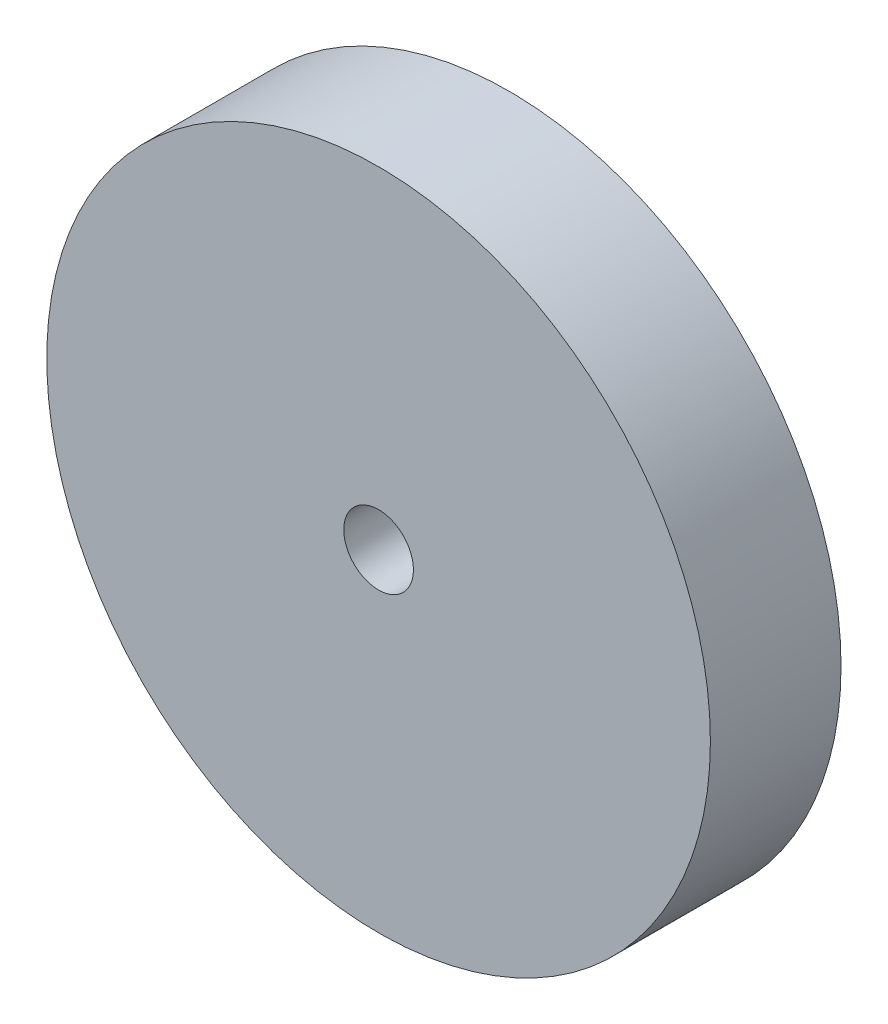
ISO-10303-21;
HEADER;
FILE_DESCRIPTION(('STEP AP214'),'2;1');
FILE_NAME('part.step','',(''),(''),'','','');
FILE_SCHEMA(('AUTOMOTIVE_DESIGN { 1 0 10303 214 1 1 1 1 }'));
ENDSEC;
DATA;
#1=APPLICATION_CONTEXT('core data for automotive mechanical design processes');
#2=APPLICATION_PROTOCOL_DEFINITION('international standard','automotive_design',2000,#1);
#3=PRODUCT_CONTEXT('',#1,'mechanical');
#4=PRODUCT('Part','Part','',(#3));
#5=PRODUCT_RELATED_PRODUCT_CATEGORY('part','',(#4));
#6=PRODUCT_DEFINITION_FORMATION('','',#4);
#7=PRODUCT_DEFINITION_CONTEXT('part definition',#1,'design');
#8=PRODUCT_DEFINITION('design','',#6,#7);
#9=PRODUCT_DEFINITION_SHAPE('','',#8);
#10=(LENGTH_UNIT() NAMED_UNIT(*) SI_UNIT(.MILLI.,.METRE.));
#11=(NAMED_UNIT(*) PLANE_ANGLE_UNIT() SI_UNIT($,.RADIAN.));
#12=(NAMED_UNIT(*) SI_UNIT($,.STERADIAN.) SOLID_ANGLE_UNIT());
#13=UNCERTAINTY_MEASURE_WITH_UNIT(LENGTH_MEASURE(1.E-05),#10,'distance_accuracy_value','');
#14=(GEOMETRIC_REPRESENTATION_CONTEXT(3) GLOBAL_UNCERTAINTY_ASSIGNED_CONTEXT((#13)) GLOBAL_UNIT_ASSIGNED_CONTEXT((#10,
#11,#12)) REPRESENTATION_CONTEXT('',''));
#15=CARTESIAN_POINT('',(0.,0.,0.));
#16=DIRECTION('',(0.,0.,1.));
#17=DIRECTION('',(1.,0.,0.));
#18=AXIS2_PLACEMENT_3D('',#15,#16,#17);
#19=CARTESIAN_POINT('',(0.,0.,15.));
#20=DIRECTION('',(0.,0.,1.));
#21=DIRECTION('',(1.,0.,0.));
#22=AXIS2_PLACEMENT_3D('',#19,#20,#21);
#23=PLANE('',#22);
#24=CARTESIAN_POINT('',(0.,0.,15.));
#25=DIRECTION('',(0.,0.,1.));
#26=DIRECTION('',(1.,0.,0.));
#27=AXIS2_PLACEMENT_3D('',#24,#25,#26);
#28=CIRCLE('',#27,38.1);
#29=CARTESIAN_POINT('',(38.1,0.,15.));
#30=VERTEX_POINT('',#29);
#31=EDGE_CURVE('E10',#30,#30,#28,.T.);
#32=ORIENTED_EDGE('',*,*,#31,.T.);
#33=EDGE_LOOP('',(#32));
#34=FACE_BOUND('',#33,.T.);
#35=CARTESIAN_POINT('',(0.,0.,15.));
#36=DIRECTION('',(0.,0.,1.));
#37=DIRECTION('',(1.,0.,0.));
#38=AXIS2_PLACEMENT_3D('',#35,#36,#37);
#39=CIRCLE('',#38,4.);
#40=CARTESIAN_POINT('',(4.,0.,15.));
#41=VERTEX_POINT('',#40);
#42=EDGE_CURVE('E41',#41,#41,#39,.T.);
#43=ORIENTED_EDGE('',*,*,#42,.F.);
#44=EDGE_LOOP('',(#43));
#45=FACE_BOUND('',#44,.T.);
#46=ADVANCED_FACE('F30',(#34,#45),#23,.T.);
#47=CARTESIAN_POINT('',(0.,0.,0.));
#48=DIRECTION('',(0.,0.,1.));
#49=DIRECTION('',(1.,0.,0.));
#50=AXIS2_PLACEMENT_3D('',#47,#48,#49);
#51=PLANE('',#50);
#52=CARTESIAN_POINT('',(0.,0.,0.));
#53=DIRECTION('',(0.,0.,1.));
#54=DIRECTION('',(1.,0.,0.));
#55=AXIS2_PLACEMENT_3D('',#52,#53,#54);
#56=CIRCLE('',#55,38.1);
#57=CARTESIAN_POINT('',(38.1,0.,0.));
#58=VERTEX_POINT('',#57);
#59=EDGE_CURVE('E34',#58,#58,#56,.T.);
#60=ORIENTED_EDGE('',*,*,#59,.F.);
#61=EDGE_LOOP('',(#60));
#62=FACE_BOUND('',#61,.T.);
#63=CARTESIAN_POINT('',(0.,0.,0.));
#64=DIRECTION('',(0.,0.,1.));
#65=DIRECTION('',(1.,0.,0.));
#66=AXIS2_PLACEMENT_3D('',#63,#64,#65);
#67=CIRCLE('',#66,4.);
#68=CARTESIAN_POINT('',(4.,0.,0.));
#69=VERTEX_POINT('',#68);
#70=EDGE_CURVE('E43',#69,#69,#67,.T.);
#71=ORIENTED_EDGE('',*,*,#70,.T.);
#72=EDGE_LOOP('',(#71));
#73=FACE_BOUND('',#72,.T.);
#74=ADVANCED_FACE('F53',(#62,#73),#51,.F.);
#75=CARTESIAN_POINT('',(0.,0.,15.));
#76=DIRECTION('',(0.,0.,-1.));
#77=DIRECTION('',(-1.,0.,0.));
#78=AXIS2_PLACEMENT_3D('',#75,#76,#77);
#79=CYLINDRICAL_SURFACE('',#78,38.1);
#80=ORIENTED_EDGE('',*,*,#31,.F.);
#81=EDGE_LOOP('',(#80));
#82=FACE_BOUND('',#81,.T.);
#83=ORIENTED_EDGE('',*,*,#59,.T.);
#84=EDGE_LOOP('',(#83));
#85=FACE_BOUND('',#84,.T.);
#86=ADVANCED_FACE('F32',(#82,#85),#79,.T.);
#87=CARTESIAN_POINT('',(0.,0.,15.));
#88=DIRECTION('',(0.,0.,-1.));
#89=DIRECTION('',(-1.,0.,0.));
#90=AXIS2_PLACEMENT_3D('',#87,#88,#89);
#91=CYLINDRICAL_SURFACE('',#90,4.);
#92=ORIENTED_EDGE('',*,*,#42,.T.);
#93=EDGE_LOOP('',(#92));
#94=FACE_BOUND('',#93,.T.);
#95=ORIENTED_EDGE('',*,*,#70,.F.);
#96=EDGE_LOOP('',(#95));
#97=FACE_BOUND('',#96,.T.);
#98=ADVANCED_FACE('F49',(#94,#97),#91,.F.);
#99=CLOSED_SHELL('',(#46,#74,#86,#98));
#100=MANIFOLD_SOLID_BREP('B2',#99);
#101=ADVANCED_BREP_SHAPE_REPRESENTATION('',(#18,#100),#14);
#102=SHAPE_DEFINITION_REPRESENTATION(#9,#101);
ENDSEC;
END-ISO-10303-21;
